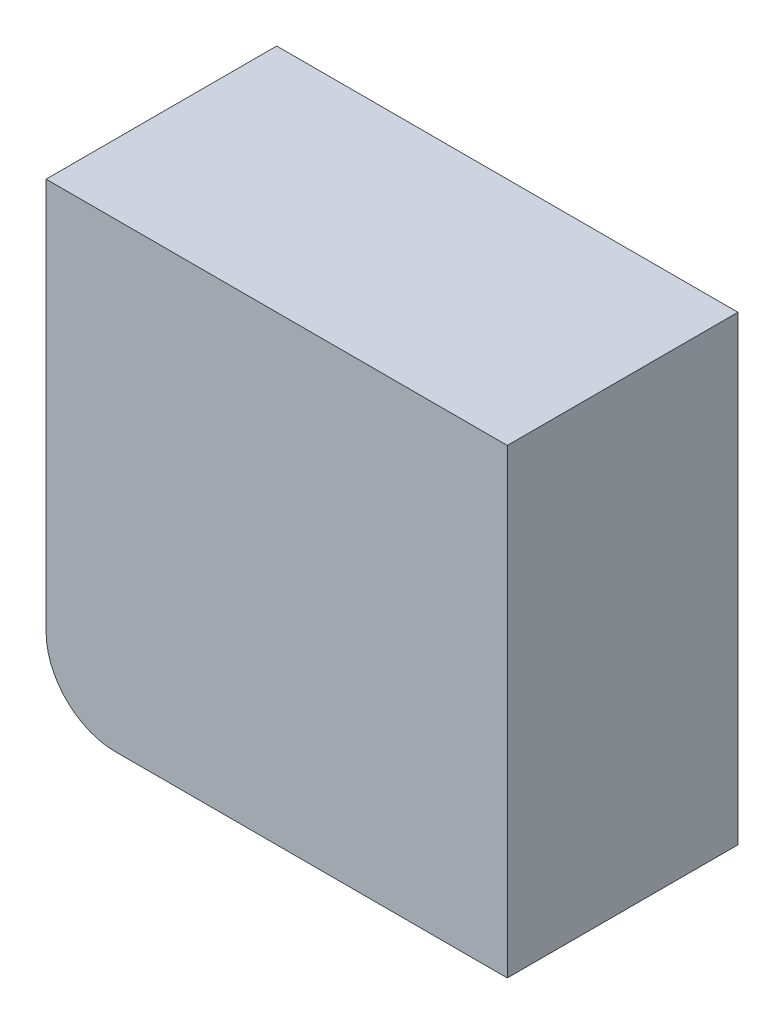
ISO-10303-21;
HEADER;
FILE_DESCRIPTION(('STEP AP214'),'2;1');
FILE_NAME('part.step','',(''),(''),'','','');
FILE_SCHEMA(('AUTOMOTIVE_DESIGN { 1 0 10303 214 1 1 1 1 }'));
ENDSEC;
DATA;
#1=APPLICATION_CONTEXT('core data for automotive mechanical design processes');
#2=APPLICATION_PROTOCOL_DEFINITION('international standard','automotive_design',2000,#1);
#3=PRODUCT_CONTEXT('',#1,'mechanical');
#4=PRODUCT('Part','Part','',(#3));
#5=PRODUCT_RELATED_PRODUCT_CATEGORY('part','',(#4));
#6=PRODUCT_DEFINITION_FORMATION('','',#4);
#7=PRODUCT_DEFINITION_CONTEXT('part definition',#1,'design');
#8=PRODUCT_DEFINITION('design','',#6,#7);
#9=PRODUCT_DEFINITION_SHAPE('','',#8);
#10=(LENGTH_UNIT() NAMED_UNIT(*) SI_UNIT(.MILLI.,.METRE.));
#11=(NAMED_UNIT(*) PLANE_ANGLE_UNIT() SI_UNIT($,.RADIAN.));
#12=(NAMED_UNIT(*) SI_UNIT($,.STERADIAN.) SOLID_ANGLE_UNIT());
#13=UNCERTAINTY_MEASURE_WITH_UNIT(LENGTH_MEASURE(1.E-05),#10,'distance_accuracy_value','');
#14=(GEOMETRIC_REPRESENTATION_CONTEXT(3) GLOBAL_UNCERTAINTY_ASSIGNED_CONTEXT((#13)) GLOBAL_UNIT_ASSIGNED_CONTEXT((#10,
#11,#12)) REPRESENTATION_CONTEXT('',''));
#15=CARTESIAN_POINT('',(0.,0.,0.));
#16=DIRECTION('',(0.,0.,1.));
#17=DIRECTION('',(1.,0.,0.));
#18=AXIS2_PLACEMENT_3D('',#15,#16,#17);
#19=CARTESIAN_POINT('',(3.,3.,10.));
#20=DIRECTION('',(0.,0.,1.));
#21=DIRECTION('',(1.,0.,0.));
#22=AXIS2_PLACEMENT_3D('',#19,#20,#21);
#23=CYLINDRICAL_SURFACE('',#22,3.);
#24=DIRECTION('',(0.,0.,1.));
#25=VECTOR('',#24,1.);
#26=CARTESIAN_POINT('',(0.,3.,10.));
#27=LINE('',#26,#25);
#28=CARTESIAN_POINT('',(0.,3.,0.));
#29=VERTEX_POINT('',#28);
#30=CARTESIAN_POINT('',(0.,3.,10.));
#31=VERTEX_POINT('',#30);
#32=EDGE_CURVE('E99',#29,#31,#27,.T.);
#33=ORIENTED_EDGE('',*,*,#32,.F.);
#34=CARTESIAN_POINT('',(3.,3.,0.));
#35=DIRECTION('',(0.,0.,-1.));
#36=DIRECTION('',(-1.,0.,0.));
#37=AXIS2_PLACEMENT_3D('',#34,#35,#36);
#38=CIRCLE('',#37,3.);
#39=CARTESIAN_POINT('',(3.,0.,0.));
#40=VERTEX_POINT('',#39);
#41=EDGE_CURVE('E49',#40,#29,#38,.T.);
#42=ORIENTED_EDGE('',*,*,#41,.F.);
#43=DIRECTION('',(0.,0.,1.));
#44=VECTOR('',#43,1.);
#45=CARTESIAN_POINT('',(3.,0.,10.));
#46=LINE('',#45,#44);
#47=CARTESIAN_POINT('',(3.,0.,10.));
#48=VERTEX_POINT('',#47);
#49=EDGE_CURVE('E124',#48,#40,#46,.F.);
#50=ORIENTED_EDGE('',*,*,#49,.F.);
#51=CARTESIAN_POINT('',(3.,3.,10.));
#52=DIRECTION('',(0.,0.,-1.));
#53=DIRECTION('',(-1.,0.,0.));
#54=AXIS2_PLACEMENT_3D('',#51,#52,#53);
#55=CIRCLE('',#54,3.);
#56=EDGE_CURVE('E11',#31,#48,#55,.F.);
#57=ORIENTED_EDGE('',*,*,#56,.F.);
#58=EDGE_LOOP('',(#33,#42,#50,#57));
#59=FACE_BOUND('',#58,.T.);
#60=ADVANCED_FACE('F43',(#59),#23,.T.);
#61=CARTESIAN_POINT('',(0.,0.,10.));
#62=DIRECTION('',(1.,0.,0.));
#63=DIRECTION('',(0.,0.,-1.));
#64=AXIS2_PLACEMENT_3D('',#61,#62,#63);
#65=PLANE('',#64);
#66=DIRECTION('',(0.,-1.,0.));
#67=VECTOR('',#66,1.);
#68=CARTESIAN_POINT('',(0.,0.,0.));
#69=LINE('',#68,#67);
#70=CARTESIAN_POINT('',(0.,20.,0.));
#71=VERTEX_POINT('',#70);
#72=EDGE_CURVE('E115',#71,#29,#69,.T.);
#73=ORIENTED_EDGE('',*,*,#72,.T.);
#74=ORIENTED_EDGE('',*,*,#32,.T.);
#75=DIRECTION('',(0.,-1.,0.));
#76=VECTOR('',#75,1.);
#77=CARTESIAN_POINT('',(0.,0.,10.));
#78=LINE('',#77,#76);
#79=CARTESIAN_POINT('',(0.,20.,10.));
#80=VERTEX_POINT('',#79);
#81=EDGE_CURVE('E93',#80,#31,#78,.T.);
#82=ORIENTED_EDGE('',*,*,#81,.F.);
#83=DIRECTION('',(0.,0.,-1.));
#84=VECTOR('',#83,1.);
#85=CARTESIAN_POINT('',(0.,20.,10.));
#86=LINE('',#85,#84);
#87=EDGE_CURVE('E107',#80,#71,#86,.T.);
#88=ORIENTED_EDGE('',*,*,#87,.T.);
#89=EDGE_LOOP('',(#73,#74,#82,#88));
#90=FACE_BOUND('',#89,.T.);
#91=ADVANCED_FACE('F134',(#90),#65,.F.);
#92=CARTESIAN_POINT('',(0.,0.,10.));
#93=DIRECTION('',(0.,1.,0.));
#94=DIRECTION('',(0.,0.,1.));
#95=AXIS2_PLACEMENT_3D('',#92,#93,#94);
#96=PLANE('',#95);
#97=DIRECTION('',(1.,0.,0.));
#98=VECTOR('',#97,1.);
#99=CARTESIAN_POINT('',(0.,0.,10.));
#100=LINE('',#99,#98);
#101=CARTESIAN_POINT('',(20.,0.,10.));
#102=VERTEX_POINT('',#101);
#103=EDGE_CURVE('E83',#48,#102,#100,.T.);
#104=ORIENTED_EDGE('',*,*,#103,.F.);
#105=ORIENTED_EDGE('',*,*,#49,.T.);
#106=DIRECTION('',(1.,0.,0.));
#107=VECTOR('',#106,1.);
#108=CARTESIAN_POINT('',(0.,0.,0.));
#109=LINE('',#108,#107);
#110=CARTESIAN_POINT('',(20.,0.,0.));
#111=VERTEX_POINT('',#110);
#112=EDGE_CURVE('E100',#40,#111,#109,.T.);
#113=ORIENTED_EDGE('',*,*,#112,.T.);
#114=DIRECTION('',(0.,0.,-1.));
#115=VECTOR('',#114,1.);
#116=CARTESIAN_POINT('',(20.,0.,10.));
#117=LINE('',#116,#115);
#118=EDGE_CURVE('E94',#102,#111,#117,.T.);
#119=ORIENTED_EDGE('',*,*,#118,.F.);
#120=EDGE_LOOP('',(#104,#105,#113,#119));
#121=FACE_BOUND('',#120,.T.);
#122=ADVANCED_FACE('F92',(#121),#96,.F.);
#123=CARTESIAN_POINT('',(20.,0.,10.));
#124=DIRECTION('',(-1.,0.,0.));
#125=DIRECTION('',(0.,0.,1.));
#126=AXIS2_PLACEMENT_3D('',#123,#124,#125);
#127=PLANE('',#126);
#128=DIRECTION('',(0.,1.,0.));
#129=VECTOR('',#128,1.);
#130=CARTESIAN_POINT('',(20.,0.,0.));
#131=LINE('',#130,#129);
#132=CARTESIAN_POINT('',(20.,20.,0.));
#133=VERTEX_POINT('',#132);
#134=EDGE_CURVE('E118',#111,#133,#131,.T.);
#135=ORIENTED_EDGE('',*,*,#134,.T.);
#136=DIRECTION('',(0.,0.,-1.));
#137=VECTOR('',#136,1.);
#138=CARTESIAN_POINT('',(20.,20.,10.));
#139=LINE('',#138,#137);
#140=CARTESIAN_POINT('',(20.,20.,10.));
#141=VERTEX_POINT('',#140);
#142=EDGE_CURVE('E101',#141,#133,#139,.T.);
#143=ORIENTED_EDGE('',*,*,#142,.F.);
#144=DIRECTION('',(0.,1.,0.));
#145=VECTOR('',#144,1.);
#146=CARTESIAN_POINT('',(20.,0.,10.));
#147=LINE('',#146,#145);
#148=EDGE_CURVE('E86',#102,#141,#147,.T.);
#149=ORIENTED_EDGE('',*,*,#148,.F.);
#150=ORIENTED_EDGE('',*,*,#118,.T.);
#151=EDGE_LOOP('',(#135,#143,#149,#150));
#152=FACE_BOUND('',#151,.T.);
#153=ADVANCED_FACE('F103',(#152),#127,.F.);
#154=CARTESIAN_POINT('',(0.,20.,10.));
#155=DIRECTION('',(0.,-1.,0.));
#156=DIRECTION('',(0.,0.,-1.));
#157=AXIS2_PLACEMENT_3D('',#154,#155,#156);
#158=PLANE('',#157);
#159=DIRECTION('',(-1.,0.,0.));
#160=VECTOR('',#159,1.);
#161=CARTESIAN_POINT('',(0.,20.,0.));
#162=LINE('',#161,#160);
#163=EDGE_CURVE('E117',#133,#71,#162,.T.);
#164=ORIENTED_EDGE('',*,*,#163,.T.);
#165=ORIENTED_EDGE('',*,*,#87,.F.);
#166=DIRECTION('',(-1.,0.,0.));
#167=VECTOR('',#166,1.);
#168=CARTESIAN_POINT('',(0.,20.,10.));
#169=LINE('',#168,#167);
#170=EDGE_CURVE('E106',#141,#80,#169,.T.);
#171=ORIENTED_EDGE('',*,*,#170,.F.);
#172=ORIENTED_EDGE('',*,*,#142,.T.);
#173=EDGE_LOOP('',(#164,#165,#171,#172));
#174=FACE_BOUND('',#173,.T.);
#175=ADVANCED_FACE('F131',(#174),#158,.F.);
#176=CARTESIAN_POINT('',(0.,0.,10.));
#177=DIRECTION('',(0.,0.,-1.));
#178=DIRECTION('',(-1.,0.,0.));
#179=AXIS2_PLACEMENT_3D('',#176,#177,#178);
#180=PLANE('',#179);
#181=ORIENTED_EDGE('',*,*,#81,.T.);
#182=ORIENTED_EDGE('',*,*,#56,.T.);
#183=ORIENTED_EDGE('',*,*,#103,.T.);
#184=ORIENTED_EDGE('',*,*,#148,.T.);
#185=ORIENTED_EDGE('',*,*,#170,.T.);
#186=EDGE_LOOP('',(#181,#182,#183,#184,#185));
#187=FACE_BOUND('',#186,.T.);
#188=ADVANCED_FACE('F88',(#187),#180,.F.);
#189=CARTESIAN_POINT('',(0.,0.,0.));
#190=DIRECTION('',(0.,0.,-1.));
#191=DIRECTION('',(-1.,0.,0.));
#192=AXIS2_PLACEMENT_3D('',#189,#190,#191);
#193=PLANE('',#192);
#194=ORIENTED_EDGE('',*,*,#112,.F.);
#195=ORIENTED_EDGE('',*,*,#41,.T.);
#196=ORIENTED_EDGE('',*,*,#72,.F.);
#197=ORIENTED_EDGE('',*,*,#163,.F.);
#198=ORIENTED_EDGE('',*,*,#134,.F.);
#199=EDGE_LOOP('',(#194,#195,#196,#197,#198));
#200=FACE_BOUND('',#199,.T.);
#201=ADVANCED_FACE('F126',(#200),#193,.T.);
#202=CLOSED_SHELL('',(#60,#91,#122,#153,#175,#188,#201));
#203=MANIFOLD_SOLID_BREP('B2',#202);
#204=ADVANCED_BREP_SHAPE_REPRESENTATION('',(#18,#203),#14);
#205=SHAPE_DEFINITION_REPRESENTATION(#9,#204);
ENDSEC;
END-ISO-10303-21;
